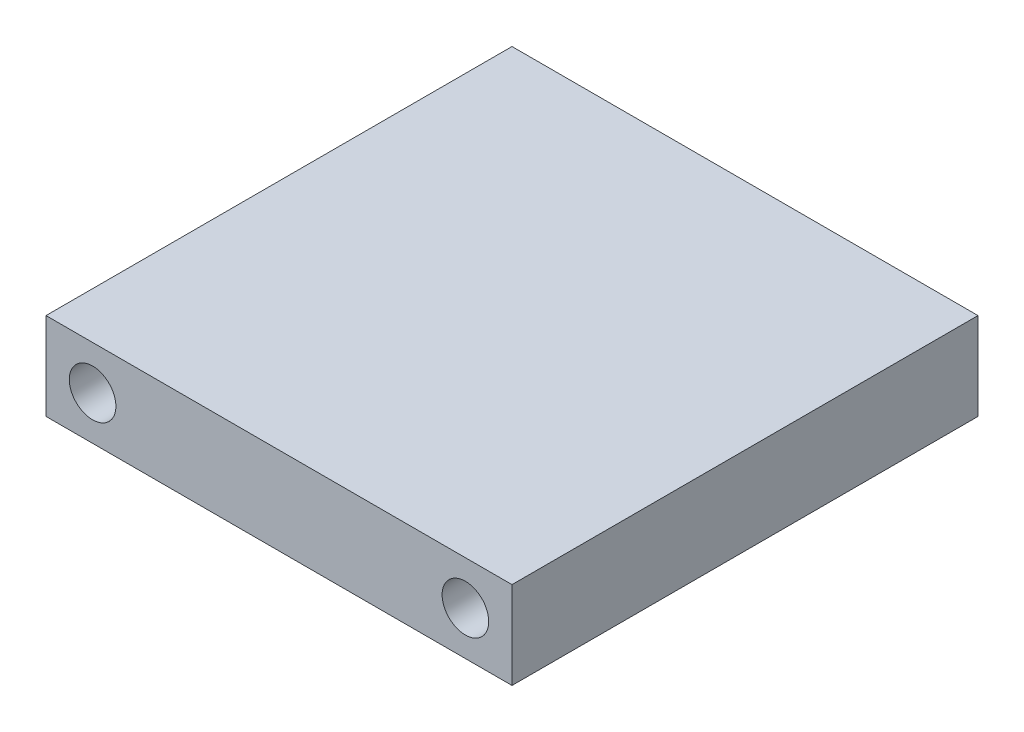
ISO-10303-21;
HEADER;
FILE_DESCRIPTION(('STEP AP214'),'2;1');
FILE_NAME('part.step','',(''),(''),'','','');
FILE_SCHEMA(('AUTOMOTIVE_DESIGN { 1 0 10303 214 1 1 1 1 }'));
ENDSEC;
DATA;
#1=APPLICATION_CONTEXT('core data for automotive mechanical design processes');
#2=APPLICATION_PROTOCOL_DEFINITION('international standard','automotive_design',2000,#1);
#3=PRODUCT_CONTEXT('',#1,'mechanical');
#4=PRODUCT('Part','Part','',(#3));
#5=PRODUCT_RELATED_PRODUCT_CATEGORY('part','',(#4));
#6=PRODUCT_DEFINITION_FORMATION('','',#4);
#7=PRODUCT_DEFINITION_CONTEXT('part definition',#1,'design');
#8=PRODUCT_DEFINITION('design','',#6,#7);
#9=PRODUCT_DEFINITION_SHAPE('','',#8);
#10=(LENGTH_UNIT() NAMED_UNIT(*) SI_UNIT(.MILLI.,.METRE.));
#11=(NAMED_UNIT(*) PLANE_ANGLE_UNIT() SI_UNIT($,.RADIAN.));
#12=(NAMED_UNIT(*) SI_UNIT($,.STERADIAN.) SOLID_ANGLE_UNIT());
#13=UNCERTAINTY_MEASURE_WITH_UNIT(LENGTH_MEASURE(1.E-05),#10,'distance_accuracy_value','');
#14=(GEOMETRIC_REPRESENTATION_CONTEXT(3) GLOBAL_UNCERTAINTY_ASSIGNED_CONTEXT((#13)) GLOBAL_UNIT_ASSIGNED_CONTEXT((#10,
#11,#12)) REPRESENTATION_CONTEXT('',''));
#15=CARTESIAN_POINT('',(0.,0.,0.));
#16=DIRECTION('',(0.,0.,1.));
#17=DIRECTION('',(1.,0.,0.));
#18=AXIS2_PLACEMENT_3D('',#15,#16,#17);
#19=CARTESIAN_POINT('',(-25.4,9.525,-25.4));
#20=DIRECTION('',(0.,0.,-1.));
#21=DIRECTION('',(-1.,0.,0.));
#22=AXIS2_PLACEMENT_3D('',#19,#20,#21);
#23=PLANE('',#22);
#24=CARTESIAN_POINT('',(20.32,4.7625,-25.4));
#25=DIRECTION('',(0.,0.,1.));
#26=DIRECTION('',(1.,0.,0.));
#27=AXIS2_PLACEMENT_3D('',#24,#25,#26);
#28=CIRCLE('',#27,2.54);
#29=CARTESIAN_POINT('',(22.86,4.7625,-25.4));
#30=VERTEX_POINT('',#29);
#31=EDGE_CURVE('E126',#30,#30,#28,.T.);
#32=ORIENTED_EDGE('',*,*,#31,.T.);
#33=EDGE_LOOP('',(#32));
#34=FACE_BOUND('',#33,.T.);
#35=CARTESIAN_POINT('',(-20.32,4.7625,-25.4));
#36=DIRECTION('',(0.,0.,1.));
#37=DIRECTION('',(1.,0.,0.));
#38=AXIS2_PLACEMENT_3D('',#35,#36,#37);
#39=CIRCLE('',#38,2.54);
#40=CARTESIAN_POINT('',(-17.78,4.7625,-25.4));
#41=VERTEX_POINT('',#40);
#42=EDGE_CURVE('E149',#41,#41,#39,.T.);
#43=ORIENTED_EDGE('',*,*,#42,.T.);
#44=EDGE_LOOP('',(#43));
#45=FACE_BOUND('',#44,.T.);
#46=DIRECTION('',(1.,0.,0.));
#47=VECTOR('',#46,1.);
#48=CARTESIAN_POINT('',(-25.4,0.,-25.4));
#49=LINE('',#48,#47);
#50=CARTESIAN_POINT('',(-25.4,0.,-25.4));
#51=VERTEX_POINT('',#50);
#52=CARTESIAN_POINT('',(25.4,0.,-25.4));
#53=VERTEX_POINT('',#52);
#54=EDGE_CURVE('E121',#51,#53,#49,.T.);
#55=ORIENTED_EDGE('',*,*,#54,.F.);
#56=DIRECTION('',(0.,-1.,0.));
#57=VECTOR('',#56,1.);
#58=CARTESIAN_POINT('',(-25.4,9.525,-25.4));
#59=LINE('',#58,#57);
#60=CARTESIAN_POINT('',(-25.4,9.525,-25.4));
#61=VERTEX_POINT('',#60);
#62=EDGE_CURVE('E11',#61,#51,#59,.T.);
#63=ORIENTED_EDGE('',*,*,#62,.F.);
#64=DIRECTION('',(1.,0.,0.));
#65=VECTOR('',#64,1.);
#66=CARTESIAN_POINT('',(-25.4,9.525,-25.4));
#67=LINE('',#66,#65);
#68=CARTESIAN_POINT('',(25.4,9.525,-25.4));
#69=VERTEX_POINT('',#68);
#70=EDGE_CURVE('E113',#61,#69,#67,.T.);
#71=ORIENTED_EDGE('',*,*,#70,.T.);
#72=DIRECTION('',(0.,-1.,0.));
#73=VECTOR('',#72,1.);
#74=CARTESIAN_POINT('',(25.4,9.525,-25.4));
#75=LINE('',#74,#73);
#76=EDGE_CURVE('E52',#69,#53,#75,.T.);
#77=ORIENTED_EDGE('',*,*,#76,.T.);
#78=EDGE_LOOP('',(#55,#63,#71,#77));
#79=FACE_BOUND('',#78,.T.);
#80=ADVANCED_FACE('F49',(#34,#45,#79),#23,.T.);
#81=CARTESIAN_POINT('',(-25.4,9.525,-25.4));
#82=DIRECTION('',(1.,0.,0.));
#83=DIRECTION('',(0.,0.,-1.));
#84=AXIS2_PLACEMENT_3D('',#81,#82,#83);
#85=PLANE('',#84);
#86=DIRECTION('',(0.,0.,1.));
#87=VECTOR('',#86,1.);
#88=CARTESIAN_POINT('',(-25.4,0.,-25.4));
#89=LINE('',#88,#87);
#90=CARTESIAN_POINT('',(-25.4,0.,25.4));
#91=VERTEX_POINT('',#90);
#92=EDGE_CURVE('E83',#51,#91,#89,.T.);
#93=ORIENTED_EDGE('',*,*,#92,.T.);
#94=DIRECTION('',(0.,-1.,0.));
#95=VECTOR('',#94,1.);
#96=CARTESIAN_POINT('',(-25.4,9.525,25.4));
#97=LINE('',#96,#95);
#98=CARTESIAN_POINT('',(-25.4,9.525,25.4));
#99=VERTEX_POINT('',#98);
#100=EDGE_CURVE('E59',#99,#91,#97,.T.);
#101=ORIENTED_EDGE('',*,*,#100,.F.);
#102=DIRECTION('',(0.,0.,1.));
#103=VECTOR('',#102,1.);
#104=CARTESIAN_POINT('',(-25.4,9.525,-25.4));
#105=LINE('',#104,#103);
#106=EDGE_CURVE('E100',#61,#99,#105,.T.);
#107=ORIENTED_EDGE('',*,*,#106,.F.);
#108=ORIENTED_EDGE('',*,*,#62,.T.);
#109=EDGE_LOOP('',(#93,#101,#107,#108));
#110=FACE_BOUND('',#109,.T.);
#111=ADVANCED_FACE('F138',(#110),#85,.F.);
#112=CARTESIAN_POINT('',(-25.4,9.525,25.4));
#113=DIRECTION('',(0.,0.,-1.));
#114=DIRECTION('',(-1.,0.,0.));
#115=AXIS2_PLACEMENT_3D('',#112,#113,#114);
#116=PLANE('',#115);
#117=CARTESIAN_POINT('',(20.32,4.7625,25.4));
#118=DIRECTION('',(0.,0.,1.));
#119=DIRECTION('',(1.,0.,0.));
#120=AXIS2_PLACEMENT_3D('',#117,#118,#119);
#121=CIRCLE('',#120,2.54);
#122=CARTESIAN_POINT('',(22.86,4.7625,25.4));
#123=VERTEX_POINT('',#122);
#124=EDGE_CURVE('E155',#123,#123,#121,.T.);
#125=ORIENTED_EDGE('',*,*,#124,.F.);
#126=EDGE_LOOP('',(#125));
#127=FACE_BOUND('',#126,.T.);
#128=CARTESIAN_POINT('',(-20.32,4.7625,25.4));
#129=DIRECTION('',(0.,0.,1.));
#130=DIRECTION('',(1.,0.,0.));
#131=AXIS2_PLACEMENT_3D('',#128,#129,#130);
#132=CIRCLE('',#131,2.54);
#133=CARTESIAN_POINT('',(-17.78,4.7625,25.4));
#134=VERTEX_POINT('',#133);
#135=EDGE_CURVE('E152',#134,#134,#132,.T.);
#136=ORIENTED_EDGE('',*,*,#135,.F.);
#137=EDGE_LOOP('',(#136));
#138=FACE_BOUND('',#137,.T.);
#139=DIRECTION('',(1.,0.,0.));
#140=VECTOR('',#139,1.);
#141=CARTESIAN_POINT('',(-25.4,0.,25.4));
#142=LINE('',#141,#140);
#143=CARTESIAN_POINT('',(25.4,0.,25.4));
#144=VERTEX_POINT('',#143);
#145=EDGE_CURVE('E108',#91,#144,#142,.T.);
#146=ORIENTED_EDGE('',*,*,#145,.T.);
#147=DIRECTION('',(0.,-1.,0.));
#148=VECTOR('',#147,1.);
#149=CARTESIAN_POINT('',(25.4,9.525,25.4));
#150=LINE('',#149,#148);
#151=CARTESIAN_POINT('',(25.4,9.525,25.4));
#152=VERTEX_POINT('',#151);
#153=EDGE_CURVE('E105',#152,#144,#150,.T.);
#154=ORIENTED_EDGE('',*,*,#153,.F.);
#155=DIRECTION('',(1.,0.,0.));
#156=VECTOR('',#155,1.);
#157=CARTESIAN_POINT('',(-25.4,9.525,25.4));
#158=LINE('',#157,#156);
#159=EDGE_CURVE('E95',#99,#152,#158,.T.);
#160=ORIENTED_EDGE('',*,*,#159,.F.);
#161=ORIENTED_EDGE('',*,*,#100,.T.);
#162=EDGE_LOOP('',(#146,#154,#160,#161));
#163=FACE_BOUND('',#162,.T.);
#164=ADVANCED_FACE('F106',(#127,#138,#163),#116,.F.);
#165=CARTESIAN_POINT('',(25.4,9.525,-25.4));
#166=DIRECTION('',(1.,0.,0.));
#167=DIRECTION('',(0.,0.,-1.));
#168=AXIS2_PLACEMENT_3D('',#165,#166,#167);
#169=PLANE('',#168);
#170=DIRECTION('',(0.,0.,1.));
#171=VECTOR('',#170,1.);
#172=CARTESIAN_POINT('',(25.4,0.,-25.4));
#173=LINE('',#172,#171);
#174=EDGE_CURVE('E125',#53,#144,#173,.T.);
#175=ORIENTED_EDGE('',*,*,#174,.F.);
#176=ORIENTED_EDGE('',*,*,#76,.F.);
#177=DIRECTION('',(0.,0.,1.));
#178=VECTOR('',#177,1.);
#179=CARTESIAN_POINT('',(25.4,9.525,-25.4));
#180=LINE('',#179,#178);
#181=EDGE_CURVE('E99',#69,#152,#180,.T.);
#182=ORIENTED_EDGE('',*,*,#181,.T.);
#183=ORIENTED_EDGE('',*,*,#153,.T.);
#184=EDGE_LOOP('',(#175,#176,#182,#183));
#185=FACE_BOUND('',#184,.T.);
#186=ADVANCED_FACE('F111',(#185),#169,.T.);
#187=CARTESIAN_POINT('',(0.,9.525,0.));
#188=DIRECTION('',(0.,-1.,0.));
#189=DIRECTION('',(0.,0.,-1.));
#190=AXIS2_PLACEMENT_3D('',#187,#188,#189);
#191=PLANE('',#190);
#192=ORIENTED_EDGE('',*,*,#70,.F.);
#193=ORIENTED_EDGE('',*,*,#106,.T.);
#194=ORIENTED_EDGE('',*,*,#159,.T.);
#195=ORIENTED_EDGE('',*,*,#181,.F.);
#196=EDGE_LOOP('',(#192,#193,#194,#195));
#197=FACE_BOUND('',#196,.T.);
#198=ADVANCED_FACE('F98',(#197),#191,.F.);
#199=CARTESIAN_POINT('',(0.,0.,0.));
#200=DIRECTION('',(0.,-1.,0.));
#201=DIRECTION('',(0.,0.,-1.));
#202=AXIS2_PLACEMENT_3D('',#199,#200,#201);
#203=PLANE('',#202);
#204=ORIENTED_EDGE('',*,*,#54,.T.);
#205=ORIENTED_EDGE('',*,*,#174,.T.);
#206=ORIENTED_EDGE('',*,*,#145,.F.);
#207=ORIENTED_EDGE('',*,*,#92,.F.);
#208=EDGE_LOOP('',(#204,#205,#206,#207));
#209=FACE_BOUND('',#208,.T.);
#210=ADVANCED_FACE('F135',(#209),#203,.T.);
#211=CARTESIAN_POINT('',(-20.32,4.7625,-25.4));
#212=DIRECTION('',(0.,0.,1.));
#213=DIRECTION('',(1.,0.,0.));
#214=AXIS2_PLACEMENT_3D('',#211,#212,#213);
#215=CYLINDRICAL_SURFACE('',#214,2.54);
#216=ORIENTED_EDGE('',*,*,#42,.F.);
#217=EDGE_LOOP('',(#216));
#218=FACE_BOUND('',#217,.T.);
#219=ORIENTED_EDGE('',*,*,#135,.T.);
#220=EDGE_LOOP('',(#219));
#221=FACE_BOUND('',#220,.T.);
#222=ADVANCED_FACE('F171',(#218,#221),#215,.F.);
#223=CARTESIAN_POINT('',(20.32,4.7625,-25.4));
#224=DIRECTION('',(0.,0.,1.));
#225=DIRECTION('',(1.,0.,0.));
#226=AXIS2_PLACEMENT_3D('',#223,#224,#225);
#227=CYLINDRICAL_SURFACE('',#226,2.54);
#228=ORIENTED_EDGE('',*,*,#31,.F.);
#229=EDGE_LOOP('',(#228));
#230=FACE_BOUND('',#229,.T.);
#231=ORIENTED_EDGE('',*,*,#124,.T.);
#232=EDGE_LOOP('',(#231));
#233=FACE_BOUND('',#232,.T.);
#234=ADVANCED_FACE('F164',(#230,#233),#227,.F.);
#235=CLOSED_SHELL('',(#80,#111,#164,#186,#198,#210,#222,#234));
#236=MANIFOLD_SOLID_BREP('B2',#235);
#237=ADVANCED_BREP_SHAPE_REPRESENTATION('',(#18,#236),#14);
#238=SHAPE_DEFINITION_REPRESENTATION(#9,#237);
ENDSEC;
END-ISO-10303-21;
